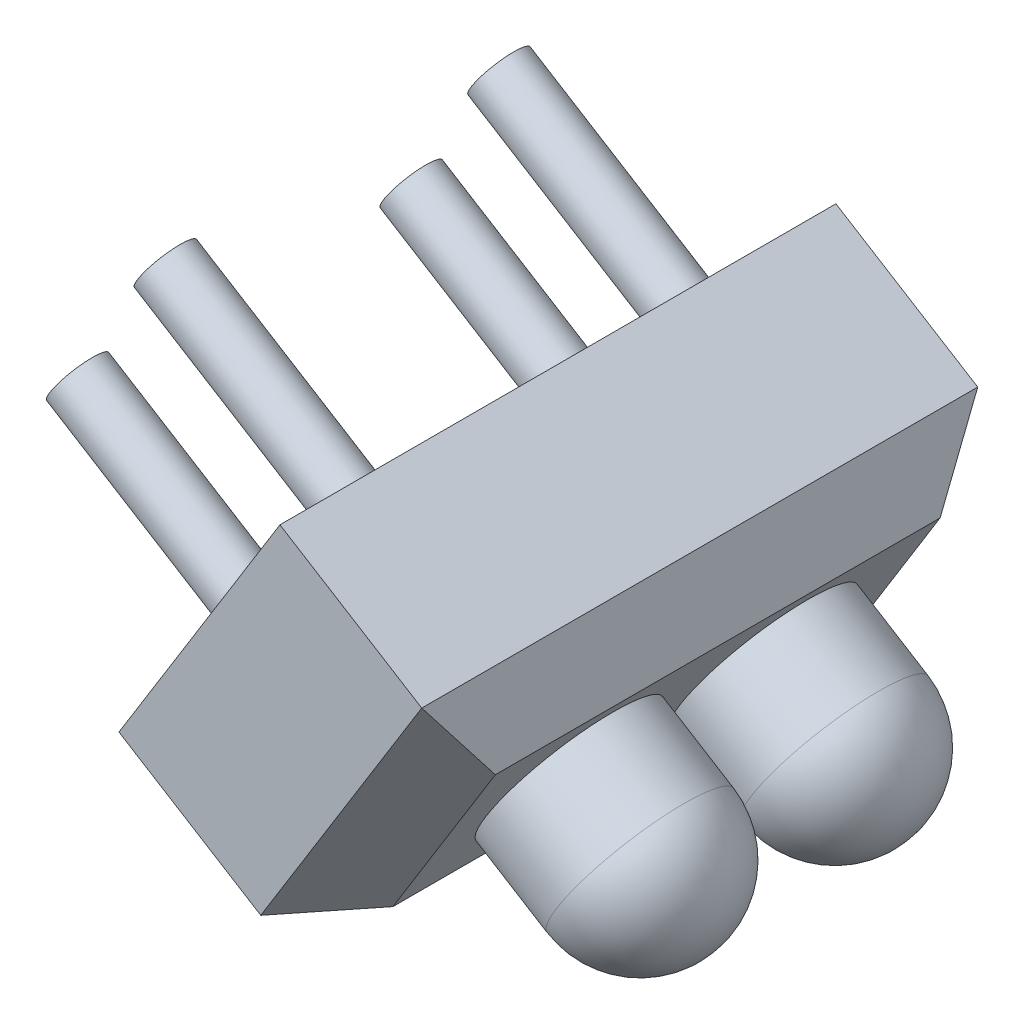
ISO-10303-21;
HEADER;
FILE_DESCRIPTION(('STEP AP214'),'2;1');
FILE_NAME('part.step','',(''),(''),'','','');
FILE_SCHEMA(('AUTOMOTIVE_DESIGN { 1 0 10303 214 1 1 1 1 }'));
ENDSEC;
DATA;
#1=APPLICATION_CONTEXT('core data for automotive mechanical design processes');
#2=APPLICATION_PROTOCOL_DEFINITION('international standard','automotive_design',2000,#1);
#3=PRODUCT_CONTEXT('',#1,'mechanical');
#4=PRODUCT('Part','Part','',(#3));
#5=PRODUCT_RELATED_PRODUCT_CATEGORY('part','',(#4));
#6=PRODUCT_DEFINITION_FORMATION('','',#4);
#7=PRODUCT_DEFINITION_CONTEXT('part definition',#1,'design');
#8=PRODUCT_DEFINITION('design','',#6,#7);
#9=PRODUCT_DEFINITION_SHAPE('','',#8);
#10=(LENGTH_UNIT() NAMED_UNIT(*) SI_UNIT(.MILLI.,.METRE.));
#11=(NAMED_UNIT(*) PLANE_ANGLE_UNIT() SI_UNIT($,.RADIAN.));
#12=(NAMED_UNIT(*) SI_UNIT($,.STERADIAN.) SOLID_ANGLE_UNIT());
#13=UNCERTAINTY_MEASURE_WITH_UNIT(LENGTH_MEASURE(1.E-05),#10,'distance_accuracy_value','');
#14=(GEOMETRIC_REPRESENTATION_CONTEXT(3) GLOBAL_UNCERTAINTY_ASSIGNED_CONTEXT((#13)) GLOBAL_UNIT_ASSIGNED_CONTEXT((#10,
#11,#12)) REPRESENTATION_CONTEXT('',''));
#15=CARTESIAN_POINT('',(0.,0.,0.));
#16=DIRECTION('',(0.,0.,1.));
#17=DIRECTION('',(1.,0.,0.));
#18=AXIS2_PLACEMENT_3D('',#15,#16,#17);
#19=CARTESIAN_POINT('',(-10.8716272687585,-17.7621904380699,9.99999999999932));
#20=DIRECTION('',(0.850181774681174,-0.526489268646541,0.));
#21=DIRECTION('',(0.526489268646541,0.850181774681174,0.));
#22=AXIS2_PLACEMENT_3D('',#19,#20,#21);
#23=CYLINDRICAL_SURFACE('',#22,0.500000000000001);
#24=CARTESIAN_POINT('',(-9.59635460673675,-18.5519243410397,9.99999999999931));
#25=DIRECTION('',(0.850181774681174,-0.526489268646541,0.));
#26=DIRECTION('',(0.526489268646541,0.850181774681174,0.));
#27=AXIS2_PLACEMENT_3D('',#24,#25,#26);
#28=CIRCLE('',#27,0.500000000000001);
#29=CARTESIAN_POINT('',(-9.33310997241347,-18.1268334536991,9.99999999999931));
#30=VERTEX_POINT('',#29);
#31=EDGE_CURVE('E13',#30,#30,#28,.F.);
#32=ORIENTED_EDGE('',*,*,#31,.F.);
#33=EDGE_LOOP('',(#32));
#34=FACE_BOUND('',#33,.T.);
#35=CARTESIAN_POINT('',(-6.19562750801203,-20.6578814156259,9.99999999999929));
#36=DIRECTION('',(0.850181774681174,-0.526489268646541,0.));
#37=DIRECTION('',(0.526489268646541,0.850181774681174,0.));
#38=AXIS2_PLACEMENT_3D('',#35,#36,#37);
#39=CIRCLE('',#38,0.500000000000001);
#40=CARTESIAN_POINT('',(-5.93238287368875,-20.2327905282853,9.99999999999929));
#41=VERTEX_POINT('',#40);
#42=EDGE_CURVE('E266',#41,#41,#39,.T.);
#43=ORIENTED_EDGE('',*,*,#42,.F.);
#44=EDGE_LOOP('',(#43));
#45=FACE_BOUND('',#44,.T.);
#46=ADVANCED_FACE('F259',(#34,#45),#23,.T.);
#47=CARTESIAN_POINT('',(-6.19562750801203,-20.6578814156259,9.99999999999929));
#48=DIRECTION('',(0.850181774681174,-0.526489268646541,0.));
#49=DIRECTION('',(0.526489268646541,0.850181774681174,0.));
#50=AXIS2_PLACEMENT_3D('',#47,#48,#49);
#51=PLANE('',#50);
#52=ORIENTED_EDGE('',*,*,#42,.T.);
#53=EDGE_LOOP('',(#52));
#54=FACE_BOUND('',#53,.T.);
#55=ADVANCED_FACE('F272',(#54),#51,.T.);
#56=CARTESIAN_POINT('',(11.4632161391248,15.4553466462074,-1.66728439301483));
#57=DIRECTION('',(0.850181774681174,-0.526489268646541,0.));
#58=DIRECTION('',(0.526489268646541,0.850181774681174,0.));
#59=AXIS2_PLACEMENT_3D('',#56,#57,#58);
#60=PLANE('',#59);
#61=ORIENTED_EDGE('',*,*,#31,.T.);
#62=EDGE_LOOP('',(#61));
#63=FACE_BOUND('',#62,.T.);
#64=ADVANCED_FACE('F261',(#63),#60,.F.);
#65=CLOSED_SHELL('',(#46,#55,#64));
#66=MANIFOLD_SOLID_BREP('B2',#65);
#67=CARTESIAN_POINT('',(-6.19562750801206,-20.6578814156259,3.99999999999996));
#68=DIRECTION('',(0.850181774681174,-0.526489268646541,0.));
#69=DIRECTION('',(0.526489268646541,0.850181774681174,0.));
#70=AXIS2_PLACEMENT_3D('',#67,#68,#69);
#71=PLANE('',#70);
#72=CARTESIAN_POINT('',(-6.19562750801206,-20.6578814156259,3.99999999999996));
#73=DIRECTION('',(0.850181774681174,-0.526489268646541,0.));
#74=DIRECTION('',(0.526489268646541,0.850181774681174,0.));
#75=AXIS2_PLACEMENT_3D('',#72,#73,#74);
#76=CIRCLE('',#75,0.500000000000001);
#77=CARTESIAN_POINT('',(-5.93238287368878,-20.2327905282853,3.99999999999996));
#78=VERTEX_POINT('',#77);
#79=EDGE_CURVE('E315',#78,#78,#76,.T.);
#80=ORIENTED_EDGE('',*,*,#79,.T.);
#81=EDGE_LOOP('',(#80));
#82=FACE_BOUND('',#81,.T.);
#83=ADVANCED_FACE('F308',(#82),#71,.T.);
#84=CARTESIAN_POINT('',(-10.8716272687585,-17.7621904380699,4.));
#85=DIRECTION('',(0.850181774681174,-0.526489268646541,0.));
#86=DIRECTION('',(0.526489268646541,0.850181774681174,0.));
#87=AXIS2_PLACEMENT_3D('',#84,#85,#86);
#88=CYLINDRICAL_SURFACE('',#87,0.500000000000001);
#89=CARTESIAN_POINT('',(-9.59635460673681,-18.5519243410397,3.99999999999999));
#90=DIRECTION('',(0.850181774681174,-0.526489268646541,0.));
#91=DIRECTION('',(0.526489268646541,0.850181774681174,0.));
#92=AXIS2_PLACEMENT_3D('',#89,#90,#91);
#93=CIRCLE('',#92,0.500000000000001);
#94=CARTESIAN_POINT('',(-9.33310997241354,-18.1268334536991,3.99999999999999));
#95=VERTEX_POINT('',#94);
#96=EDGE_CURVE('E258',#95,#95,#93,.F.);
#97=ORIENTED_EDGE('',*,*,#96,.F.);
#98=EDGE_LOOP('',(#97));
#99=FACE_BOUND('',#98,.T.);
#100=ORIENTED_EDGE('',*,*,#79,.F.);
#101=EDGE_LOOP('',(#100));
#102=FACE_BOUND('',#101,.T.);
#103=ADVANCED_FACE('F322',(#99,#102),#88,.T.);
#104=CARTESIAN_POINT('',(11.4632161391248,15.4553466462074,-1.66728439301483));
#105=DIRECTION('',(0.850181774681174,-0.526489268646541,0.));
#106=DIRECTION('',(0.526489268646541,0.850181774681174,0.));
#107=AXIS2_PLACEMENT_3D('',#104,#105,#106);
#108=PLANE('',#107);
#109=ORIENTED_EDGE('',*,*,#96,.T.);
#110=EDGE_LOOP('',(#109));
#111=FACE_BOUND('',#110,.T.);
#112=ADVANCED_FACE('F310',(#111),#108,.F.);
#113=CLOSED_SHELL('',(#83,#103,#112));
#114=MANIFOLD_SOLID_BREP('B8',#113);
#115=CARTESIAN_POINT('',(-7.77509531395168,-23.2084267396694,3.99999999999997));
#116=DIRECTION('',(0.850181774681174,-0.526489268646541,0.));
#117=DIRECTION('',(0.526489268646541,0.850181774681174,0.));
#118=AXIS2_PLACEMENT_3D('',#115,#116,#117);
#119=PLANE('',#118);
#120=CARTESIAN_POINT('',(-7.77509531395168,-23.2084267396694,3.99999999999997));
#121=DIRECTION('',(0.850181774681174,-0.526489268646541,0.));
#122=DIRECTION('',(0.526489268646541,0.850181774681174,0.));
#123=AXIS2_PLACEMENT_3D('',#120,#121,#122);
#124=CIRCLE('',#123,0.500000000000002);
#125=CARTESIAN_POINT('',(-7.51185067962841,-22.7833358523288,3.99999999999997));
#126=VERTEX_POINT('',#125);
#127=EDGE_CURVE('E367',#126,#126,#124,.T.);
#128=ORIENTED_EDGE('',*,*,#127,.T.);
#129=EDGE_LOOP('',(#128));
#130=FACE_BOUND('',#129,.T.);
#131=ADVANCED_FACE('F360',(#130),#119,.T.);
#132=CARTESIAN_POINT('',(-12.4510950746981,-20.3127357621134,4.));
#133=DIRECTION('',(0.850181774681174,-0.526489268646541,0.));
#134=DIRECTION('',(0.526489268646541,0.850181774681174,0.));
#135=AXIS2_PLACEMENT_3D('',#132,#133,#134);
#136=CYLINDRICAL_SURFACE('',#135,0.500000000000002);
#137=CARTESIAN_POINT('',(-11.1758224126764,-21.1024696650832,3.99999999999999));
#138=DIRECTION('',(0.850181774681174,-0.526489268646541,0.));
#139=DIRECTION('',(0.526489268646541,0.850181774681174,0.));
#140=AXIS2_PLACEMENT_3D('',#137,#138,#139);
#141=CIRCLE('',#140,0.500000000000002);
#142=CARTESIAN_POINT('',(-10.9125777783532,-20.6773787777426,3.99999999999999));
#143=VERTEX_POINT('',#142);
#144=EDGE_CURVE('E307',#143,#143,#141,.F.);
#145=ORIENTED_EDGE('',*,*,#144,.F.);
#146=EDGE_LOOP('',(#145));
#147=FACE_BOUND('',#146,.T.);
#148=ORIENTED_EDGE('',*,*,#127,.F.);
#149=EDGE_LOOP('',(#148));
#150=FACE_BOUND('',#149,.T.);
#151=ADVANCED_FACE('F374',(#147,#150),#136,.T.);
#152=CARTESIAN_POINT('',(11.4632161391248,15.4553466462074,-1.66728439301483));
#153=DIRECTION('',(0.850181774681174,-0.526489268646541,0.));
#154=DIRECTION('',(0.526489268646541,0.850181774681174,0.));
#155=AXIS2_PLACEMENT_3D('',#152,#153,#154);
#156=PLANE('',#155);
#157=ORIENTED_EDGE('',*,*,#144,.T.);
#158=EDGE_LOOP('',(#157));
#159=FACE_BOUND('',#158,.T.);
#160=ADVANCED_FACE('F362',(#159),#156,.F.);
#161=CLOSED_SHELL('',(#131,#151,#160));
#162=MANIFOLD_SOLID_BREP('B253',#161);
#163=CARTESIAN_POINT('',(-2.13678882347914,-21.7011112718606,11.9999999999993));
#164=DIRECTION('',(0.,0.,-1.));
#165=DIRECTION('',(-1.,0.,0.));
#166=AXIS2_PLACEMENT_3D('',#163,#164,#165);
#167=PLANE('',#166);
#168=DIRECTION('',(-0.850181774681174,0.526489268646541,0.));
#169=VECTOR('',#168,1.);
#170=CARTESIAN_POINT('',(-5.03247980103512,-26.3771110326071,11.9999999999993));
#171=LINE('',#170,#169);
#172=CARTESIAN_POINT('',(-5.88266157571629,-25.8506217639605,11.9999999999993));
#173=VERTEX_POINT('',#172);
#174=CARTESIAN_POINT('',(-8.43320689975981,-24.2711539580209,11.9999999999993));
#175=VERTEX_POINT('',#174);
#176=EDGE_CURVE('E461',#173,#175,#171,.T.);
#177=ORIENTED_EDGE('',*,*,#176,.F.);
#178=DIRECTION('',(0.526489268646542,0.850181774681174,0.));
#179=VECTOR('',#178,1.);
#180=CARTESIAN_POINT('',(-2.98697059816032,-21.1746220032141,11.9999999999993));
#181=LINE('',#180,#179);
#182=CARTESIAN_POINT('',(-2.98697059816032,-21.1746220032141,11.9999999999993));
#183=VERTEX_POINT('',#182);
#184=EDGE_CURVE('E424',#173,#183,#181,.T.);
#185=ORIENTED_EDGE('',*,*,#184,.T.);
#186=DIRECTION('',(-0.850181774681174,0.526489268646541,0.));
#187=VECTOR('',#186,1.);
#188=CARTESIAN_POINT('',(-2.13678882347914,-21.7011112718606,11.9999999999993));
#189=LINE('',#188,#187);
#190=CARTESIAN_POINT('',(-5.53751592220384,-19.5951541972744,11.9999999999993));
#191=VERTEX_POINT('',#190);
#192=EDGE_CURVE('E478',#183,#191,#189,.T.);
#193=ORIENTED_EDGE('',*,*,#192,.T.);
#194=DIRECTION('',(-0.526489268646542,-0.850181774681174,0.));
#195=VECTOR('',#194,1.);
#196=CARTESIAN_POINT('',(-5.53751592220384,-19.5951541972744,11.9999999999993));
#197=LINE('',#196,#195);
#198=EDGE_CURVE('E474',#191,#175,#197,.T.);
#199=ORIENTED_EDGE('',*,*,#198,.T.);
#200=EDGE_LOOP('',(#177,#185,#193,#199));
#201=FACE_BOUND('',#200,.T.);
#202=ADVANCED_FACE('F409',(#201),#167,.F.);
#203=CARTESIAN_POINT('',(-5.03247980103512,-26.3771110326071,11.9999999999993));
#204=DIRECTION('',(0.526489268646541,0.850181774681174,0.));
#205=DIRECTION('',(-0.850181774681174,0.526489268646541,0.));
#206=AXIS2_PLACEMENT_3D('',#203,#204,#205);
#207=PLANE('',#206);
#208=DIRECTION('',(-0.850181774681174,0.526489268646541,0.));
#209=VECTOR('',#208,1.);
#210=CARTESIAN_POINT('',(-5.03247980103517,-26.377111032607,1.99999999999926));
#211=LINE('',#210,#209);
#212=CARTESIAN_POINT('',(-5.88266157571634,-25.8506217639605,1.99999999999927));
#213=VERTEX_POINT('',#212);
#214=CARTESIAN_POINT('',(-8.43320689975987,-24.2711539580209,1.99999999999928));
#215=VERTEX_POINT('',#214);
#216=EDGE_CURVE('E468',#213,#215,#211,.T.);
#217=ORIENTED_EDGE('',*,*,#216,.F.);
#218=DIRECTION('',(0.,0.,1.));
#219=VECTOR('',#218,1.);
#220=CARTESIAN_POINT('',(-5.88266157571629,-25.8506217639605,11.9999999999993));
#221=LINE('',#220,#219);
#222=EDGE_CURVE('E432',#213,#173,#221,.T.);
#223=ORIENTED_EDGE('',*,*,#222,.T.);
#224=ORIENTED_EDGE('',*,*,#176,.T.);
#225=DIRECTION('',(0.,0.,-1.));
#226=VECTOR('',#225,1.);
#227=CARTESIAN_POINT('',(-8.43320689975981,-24.2711539580209,11.9999999999993));
#228=LINE('',#227,#226);
#229=EDGE_CURVE('E464',#175,#215,#228,.T.);
#230=ORIENTED_EDGE('',*,*,#229,.T.);
#231=EDGE_LOOP('',(#217,#223,#224,#230));
#232=FACE_BOUND('',#231,.T.);
#233=ADVANCED_FACE('F463',(#232),#207,.F.);
#234=CARTESIAN_POINT('',(-2.13678882347919,-21.7011112718606,1.99999999999926));
#235=DIRECTION('',(0.,0.,1.));
#236=DIRECTION('',(1.,0.,0.));
#237=AXIS2_PLACEMENT_3D('',#234,#235,#236);
#238=PLANE('',#237);
#239=DIRECTION('',(-0.850181774681174,0.526489268646541,0.));
#240=VECTOR('',#239,1.);
#241=CARTESIAN_POINT('',(-2.13678882347919,-21.7011112718606,1.99999999999926));
#242=LINE('',#241,#240);
#243=CARTESIAN_POINT('',(-2.98697059816037,-21.174622003214,1.99999999999927));
#244=VERTEX_POINT('',#243);
#245=CARTESIAN_POINT('',(-5.53751592220389,-19.5951541972744,1.99999999999929));
#246=VERTEX_POINT('',#245);
#247=EDGE_CURVE('E493',#244,#246,#242,.T.);
#248=ORIENTED_EDGE('',*,*,#247,.F.);
#249=DIRECTION('',(-0.526489268646542,-0.850181774681174,0.));
#250=VECTOR('',#249,1.);
#251=CARTESIAN_POINT('',(-5.88266157571635,-25.8506217639605,1.99999999999927));
#252=LINE('',#251,#250);
#253=EDGE_CURVE('E504',#244,#213,#252,.T.);
#254=ORIENTED_EDGE('',*,*,#253,.T.);
#255=ORIENTED_EDGE('',*,*,#216,.T.);
#256=DIRECTION('',(0.526489268646541,0.850181774681174,0.));
#257=VECTOR('',#256,1.);
#258=CARTESIAN_POINT('',(-5.53751592220389,-19.5951541972744,1.99999999999929));
#259=LINE('',#258,#257);
#260=EDGE_CURVE('E476',#215,#246,#259,.T.);
#261=ORIENTED_EDGE('',*,*,#260,.T.);
#262=EDGE_LOOP('',(#248,#254,#255,#261));
#263=FACE_BOUND('',#262,.T.);
#264=ADVANCED_FACE('F538',(#263),#238,.F.);
#265=CARTESIAN_POINT('',(-2.13678882347914,-21.7011112718606,11.9999999999993));
#266=DIRECTION('',(-0.526489268646541,-0.850181774681174,0.));
#267=DIRECTION('',(0.850181774681174,-0.526489268646541,0.));
#268=AXIS2_PLACEMENT_3D('',#265,#266,#267);
#269=PLANE('',#268);
#270=ORIENTED_EDGE('',*,*,#192,.F.);
#271=DIRECTION('',(0.,0.,-1.));
#272=VECTOR('',#271,1.);
#273=CARTESIAN_POINT('',(-2.98697059816037,-21.174622003214,1.99999999999927));
#274=LINE('',#273,#272);
#275=EDGE_CURVE('E509',#183,#244,#274,.T.);
#276=ORIENTED_EDGE('',*,*,#275,.T.);
#277=ORIENTED_EDGE('',*,*,#247,.T.);
#278=DIRECTION('',(0.,0.,1.));
#279=VECTOR('',#278,1.);
#280=CARTESIAN_POINT('',(-5.53751592220384,-19.5951541972744,11.9999999999993));
#281=LINE('',#280,#279);
#282=EDGE_CURVE('E490',#246,#191,#281,.T.);
#283=ORIENTED_EDGE('',*,*,#282,.T.);
#284=EDGE_LOOP('',(#270,#276,#277,#283));
#285=FACE_BOUND('',#284,.T.);
#286=ADVANCED_FACE('F569',(#285),#269,.F.);
#287=CARTESIAN_POINT('',(8.16917842128115,-5.05890022645608,0.));
#288=DIRECTION('',(0.850181774681174,-0.526489268646542,0.));
#289=DIRECTION('',(0.526489268646542,0.850181774681174,0.));
#290=AXIS2_PLACEMENT_3D('',#287,#288,#289);
#291=PLANE('',#290);
#292=CARTESIAN_POINT('',(-3.58463431225716,-24.0391111522338,5.24999999999926));
#293=DIRECTION('',(0.850181774681174,-0.526489268646542,0.));
#294=DIRECTION('',(0.526489268646542,0.850181774681174,0.));
#295=AXIS2_PLACEMENT_3D('',#292,#293,#294);
#296=CIRCLE('',#295,1.5);
#297=CARTESIAN_POINT('',(-2.79490040928735,-22.763838490212,5.24999999999926));
#298=VERTEX_POINT('',#297);
#299=EDGE_CURVE('E678',#298,#298,#296,.T.);
#300=ORIENTED_EDGE('',*,*,#299,.F.);
#301=EDGE_LOOP('',(#300));
#302=FACE_BOUND('',#301,.T.);
#303=CARTESIAN_POINT('',(-3.58463431225715,-24.0391111522338,8.74999999999926));
#304=DIRECTION('',(0.850181774681174,-0.526489268646542,0.));
#305=DIRECTION('',(0.526489268646542,0.850181774681174,0.));
#306=AXIS2_PLACEMENT_3D('',#303,#304,#305);
#307=CIRCLE('',#306,1.5);
#308=CARTESIAN_POINT('',(-2.79490040928733,-22.7638384902121,8.74999999999926));
#309=VERTEX_POINT('',#308);
#310=EDGE_CURVE('E486',#309,#309,#307,.T.);
#311=ORIENTED_EDGE('',*,*,#310,.F.);
#312=EDGE_LOOP('',(#311));
#313=FACE_BOUND('',#312,.T.);
#314=DIRECTION('',(0.,0.,-1.));
#315=VECTOR('',#314,1.);
#316=CARTESIAN_POINT('',(-4.50599053238863,-25.5269292579258,1.99999999999926));
#317=LINE('',#316,#315);
#318=CARTESIAN_POINT('',(-4.50599053238858,-25.5269292579259,10.9999999999993));
#319=VERTEX_POINT('',#318);
#320=CARTESIAN_POINT('',(-4.50599053238862,-25.5269292579258,2.99999999999926));
#321=VERTEX_POINT('',#320);
#322=EDGE_CURVE('E499',#319,#321,#317,.T.);
#323=ORIENTED_EDGE('',*,*,#322,.T.);
#324=DIRECTION('',(0.526489268646542,0.850181774681174,0.));
#325=VECTOR('',#324,1.);
#326=CARTESIAN_POINT('',(-2.13678882347919,-21.7011112718606,2.99999999999926));
#327=LINE('',#326,#325);
#328=CARTESIAN_POINT('',(-2.66327809212573,-22.5512930465418,2.99999999999926));
#329=VERTEX_POINT('',#328);
#330=EDGE_CURVE('E501',#321,#329,#327,.T.);
#331=ORIENTED_EDGE('',*,*,#330,.T.);
#332=DIRECTION('',(0.,0.,1.));
#333=VECTOR('',#332,1.);
#334=CARTESIAN_POINT('',(-2.66327809212568,-22.5512930465418,11.9999999999993));
#335=LINE('',#334,#333);
#336=CARTESIAN_POINT('',(-2.66327809212569,-22.5512930465418,10.9999999999993));
#337=VERTEX_POINT('',#336);
#338=EDGE_CURVE('E467',#329,#337,#335,.T.);
#339=ORIENTED_EDGE('',*,*,#338,.T.);
#340=DIRECTION('',(-0.526489268646542,-0.850181774681174,0.));
#341=VECTOR('',#340,1.);
#342=CARTESIAN_POINT('',(-5.03247980103512,-26.3771110326071,10.9999999999993));
#343=LINE('',#342,#341);
#344=EDGE_CURVE('E497',#337,#319,#343,.T.);
#345=ORIENTED_EDGE('',*,*,#344,.T.);
#346=EDGE_LOOP('',(#323,#331,#339,#345));
#347=FACE_BOUND('',#346,.T.);
#348=ADVANCED_FACE('F559',(#302,#313,#347),#291,.T.);
#349=CARTESIAN_POINT('',(4.76845132255646,-2.95294315186992,0.));
#350=DIRECTION('',(0.850181774681174,-0.526489268646542,0.));
#351=DIRECTION('',(0.526489268646542,0.850181774681174,0.));
#352=AXIS2_PLACEMENT_3D('',#349,#350,#351);
#353=PLANE('',#352);
#354=ORIENTED_EDGE('',*,*,#198,.F.);
#355=ORIENTED_EDGE('',*,*,#282,.F.);
#356=ORIENTED_EDGE('',*,*,#260,.F.);
#357=ORIENTED_EDGE('',*,*,#229,.F.);
#358=EDGE_LOOP('',(#354,#355,#356,#357));
#359=FACE_BOUND('',#358,.T.);
#360=ADVANCED_FACE('F472',(#359),#353,.F.);
#361=CARTESIAN_POINT('',(8.16917842128121,-5.05890022645611,10.9999999999993));
#362=DIRECTION('',(0.601169298118274,-0.372284132081917,0.707106781186544));
#363=DIRECTION('',(0.526489268646542,0.850181774681174,0.));
#364=AXIS2_PLACEMENT_3D('',#361,#362,#363);
#365=PLANE('',#364);
#366=DIRECTION('',(0.186883955493757,-0.794821397450818,-0.577350269189628));
#367=VECTOR('',#366,1.);
#368=CARTESIAN_POINT('',(-1.4764055699988,-27.5990868720764,7.33333333333281));
#369=LINE('',#368,#367);
#370=EDGE_CURVE('E483',#183,#337,#369,.T.);
#371=ORIENTED_EDGE('',*,*,#370,.F.);
#372=ORIENTED_EDGE('',*,*,#184,.F.);
#373=DIRECTION('',(0.794821397450818,0.186883955493765,-0.577350269189626));
#374=VECTOR('',#373,1.);
#375=CARTESIAN_POINT('',(6.54174212932466,-22.9293092319924,2.97503810713597));
#376=LINE('',#375,#374);
#377=EDGE_CURVE('E480',#319,#173,#376,.F.);
#378=ORIENTED_EDGE('',*,*,#377,.F.);
#379=ORIENTED_EDGE('',*,*,#344,.F.);
#380=EDGE_LOOP('',(#371,#372,#378,#379));
#381=FACE_BOUND('',#380,.T.);
#382=ADVANCED_FACE('F552',(#381),#365,.T.);
#383=CARTESIAN_POINT('',(-4.50599053238864,-25.5269292579258,0.));
#384=DIRECTION('',(0.22888516603636,-0.973453430200186,0.));
#385=DIRECTION('',(0.,0.,1.));
#386=AXIS2_PLACEMENT_3D('',#383,#384,#385);
#387=PLANE('',#386);
#388=ORIENTED_EDGE('',*,*,#377,.T.);
#389=ORIENTED_EDGE('',*,*,#222,.F.);
#390=DIRECTION('',(0.794821397450822,0.186883955493761,0.577350269189621));
#391=VECTOR('',#390,1.);
#392=CARTESIAN_POINT('',(-5.88266157571603,-25.8506217639604,1.9999999999995));
#393=LINE('',#392,#391);
#394=EDGE_CURVE('E513',#321,#213,#393,.F.);
#395=ORIENTED_EDGE('',*,*,#394,.F.);
#396=ORIENTED_EDGE('',*,*,#322,.F.);
#397=EDGE_LOOP('',(#388,#389,#395,#396));
#398=FACE_BOUND('',#397,.T.);
#399=ADVANCED_FACE('F549',(#398),#387,.T.);
#400=CARTESIAN_POINT('',(-2.66327809212575,-22.5512930465417,0.));
#401=DIRECTION('',(0.973453430200187,0.228885166036357,0.));
#402=DIRECTION('',(0.,0.,-1.));
#403=AXIS2_PLACEMENT_3D('',#400,#401,#402);
#404=PLANE('',#403);
#405=ORIENTED_EDGE('',*,*,#370,.T.);
#406=ORIENTED_EDGE('',*,*,#338,.F.);
#407=DIRECTION('',(-0.186883955493763,0.794821397450821,-0.577350269189623));
#408=VECTOR('',#407,1.);
#409=CARTESIAN_POINT('',(-2.9869705981603,-21.1746220032143,1.99999999999949));
#410=LINE('',#409,#408);
#411=EDGE_CURVE('E511',#244,#329,#410,.F.);
#412=ORIENTED_EDGE('',*,*,#411,.F.);
#413=ORIENTED_EDGE('',*,*,#275,.F.);
#414=EDGE_LOOP('',(#405,#406,#412,#413));
#415=FACE_BOUND('',#414,.T.);
#416=ADVANCED_FACE('F545',(#415),#404,.T.);
#417=CARTESIAN_POINT('',(8.16917842128117,-5.05890022645609,2.99999999999927));
#418=DIRECTION('',(0.601169298118268,-0.372284132081913,-0.707106781186552));
#419=DIRECTION('',(-0.526489268646542,-0.850181774681174,0.));
#420=AXIS2_PLACEMENT_3D('',#417,#418,#419);
#421=PLANE('',#420);
#422=ORIENTED_EDGE('',*,*,#394,.T.);
#423=ORIENTED_EDGE('',*,*,#253,.F.);
#424=ORIENTED_EDGE('',*,*,#411,.T.);
#425=ORIENTED_EDGE('',*,*,#330,.F.);
#426=EDGE_LOOP('',(#422,#423,#424,#425));
#427=FACE_BOUND('',#426,.T.);
#428=ADVANCED_FACE('F542',(#427),#421,.T.);
#429=CARTESIAN_POINT('',(-1.03408898821362,-25.6185789581734,8.74999999999924));
#430=DIRECTION('',(-0.850181774681173,0.526489268646542,0.));
#431=DIRECTION('',(-0.526489268646542,-0.850181774681174,0.));
#432=AXIS2_PLACEMENT_3D('',#429,#430,#431);
#433=CYLINDRICAL_SURFACE('',#432,1.5);
#434=CARTESIAN_POINT('',(-2.30936165023539,-24.8288450552036,8.74999999999925));
#435=DIRECTION('',(-0.850181774681173,0.526489268646542,0.));
#436=DIRECTION('',(-0.526489268646542,-0.850181774681174,0.));
#437=AXIS2_PLACEMENT_3D('',#434,#435,#436);
#438=CIRCLE('',#437,1.5);
#439=CARTESIAN_POINT('',(-3.0990955532052,-26.1041177172254,8.74999999999925));
#440=VERTEX_POINT('',#439);
#441=EDGE_CURVE('E417',#440,#440,#438,.T.);
#442=ORIENTED_EDGE('',*,*,#441,.T.);
#443=EDGE_LOOP('',(#442));
#444=FACE_BOUND('',#443,.T.);
#445=ORIENTED_EDGE('',*,*,#310,.T.);
#446=EDGE_LOOP('',(#445));
#447=FACE_BOUND('',#446,.T.);
#448=ADVANCED_FACE('F519',(#444,#447),#433,.T.);
#449=CARTESIAN_POINT('',(-1.03408898821364,-25.6185789581734,5.24999999999924));
#450=DIRECTION('',(-0.850181774681173,0.526489268646542,0.));
#451=DIRECTION('',(-0.526489268646542,-0.850181774681174,0.));
#452=AXIS2_PLACEMENT_3D('',#449,#450,#451);
#453=CYLINDRICAL_SURFACE('',#452,1.5);
#454=CARTESIAN_POINT('',(-2.3093616502354,-24.8288450552036,5.24999999999925));
#455=DIRECTION('',(-0.850181774681173,0.526489268646542,0.));
#456=DIRECTION('',(-0.526489268646542,-0.850181774681174,0.));
#457=AXIS2_PLACEMENT_3D('',#454,#455,#456);
#458=CIRCLE('',#457,1.5);
#459=CARTESIAN_POINT('',(-3.09909555320522,-26.1041177172254,5.24999999999925));
#460=VERTEX_POINT('',#459);
#461=EDGE_CURVE('E358',#460,#460,#458,.T.);
#462=ORIENTED_EDGE('',*,*,#461,.T.);
#463=EDGE_LOOP('',(#462));
#464=FACE_BOUND('',#463,.T.);
#465=ORIENTED_EDGE('',*,*,#299,.T.);
#466=EDGE_LOOP('',(#465));
#467=FACE_BOUND('',#466,.T.);
#468=ADVANCED_FACE('F524',(#464,#467),#453,.T.);
#469=CARTESIAN_POINT('',(-2.30936165023539,-24.8288450552036,8.74999999999925));
#470=DIRECTION('',(0.850181774681174,-0.526489268646542,0.));
#471=DIRECTION('',(0.526489268646542,0.850181774681174,0.));
#472=AXIS2_PLACEMENT_3D('',#469,#470,#471);
#473=SPHERICAL_SURFACE('',#472,1.5);
#474=ORIENTED_EDGE('',*,*,#441,.F.);
#475=EDGE_LOOP('',(#474));
#476=FACE_BOUND('',#475,.T.);
#477=ADVANCED_FACE('F522',(#476),#473,.T.);
#478=CARTESIAN_POINT('',(-2.3093616502354,-24.8288450552036,5.24999999999925));
#479=DIRECTION('',(0.850181774681174,-0.526489268646542,0.));
#480=DIRECTION('',(0.526489268646542,0.850181774681174,0.));
#481=AXIS2_PLACEMENT_3D('',#478,#479,#480);
#482=SPHERICAL_SURFACE('',#481,1.5);
#483=ORIENTED_EDGE('',*,*,#461,.F.);
#484=EDGE_LOOP('',(#483));
#485=FACE_BOUND('',#484,.T.);
#486=ADVANCED_FACE('F411',(#485),#482,.T.);
#487=CLOSED_SHELL('',(#202,#233,#264,#286,#348,#360,#382,#399,#416,#428,#448,#468,#477,#486));
#488=MANIFOLD_SOLID_BREP('B302',#487);
#489=CARTESIAN_POINT('',(-7.77509531395165,-23.2084267396694,9.99999999999929));
#490=DIRECTION('',(0.850181774681174,-0.526489268646541,0.));
#491=DIRECTION('',(0.526489268646541,0.850181774681174,0.));
#492=AXIS2_PLACEMENT_3D('',#489,#490,#491);
#493=PLANE('',#492);
#494=CARTESIAN_POINT('',(-7.77509531395165,-23.2084267396694,9.99999999999929));
#495=DIRECTION('',(0.850181774681174,-0.526489268646541,0.));
#496=DIRECTION('',(0.526489268646541,0.850181774681174,0.));
#497=AXIS2_PLACEMENT_3D('',#494,#495,#496);
#498=CIRCLE('',#497,0.500000000000004);
#499=CARTESIAN_POINT('',(-7.51185067962838,-22.7833358523288,9.99999999999929));
#500=VERTEX_POINT('',#499);
#501=EDGE_CURVE('E408',#500,#500,#498,.T.);
#502=ORIENTED_EDGE('',*,*,#501,.T.);
#503=EDGE_LOOP('',(#502));
#504=FACE_BOUND('',#503,.T.);
#505=ADVANCED_FACE('F686',(#504),#493,.T.);
#506=CARTESIAN_POINT('',(-12.4510950746981,-20.3127357621134,9.99999999999932));
#507=DIRECTION('',(0.850181774681174,-0.526489268646541,0.));
#508=DIRECTION('',(0.526489268646541,0.850181774681174,0.));
#509=AXIS2_PLACEMENT_3D('',#506,#507,#508);
#510=CYLINDRICAL_SURFACE('',#509,0.500000000000004);
#511=CARTESIAN_POINT('',(-11.1758224126764,-21.1024696650832,9.99999999999931));
#512=DIRECTION('',(0.850181774681174,-0.526489268646541,0.));
#513=DIRECTION('',(0.526489268646541,0.850181774681174,0.));
#514=AXIS2_PLACEMENT_3D('',#511,#512,#513);
#515=CIRCLE('',#514,0.500000000000004);
#516=CARTESIAN_POINT('',(-10.9125777783531,-20.6773787777427,9.99999999999931));
#517=VERTEX_POINT('',#516);
#518=EDGE_CURVE('E693',#517,#517,#515,.F.);
#519=ORIENTED_EDGE('',*,*,#518,.F.);
#520=EDGE_LOOP('',(#519));
#521=FACE_BOUND('',#520,.T.);
#522=ORIENTED_EDGE('',*,*,#501,.F.);
#523=EDGE_LOOP('',(#522));
#524=FACE_BOUND('',#523,.T.);
#525=ADVANCED_FACE('F688',(#521,#524),#510,.T.);
#526=CARTESIAN_POINT('',(11.4632161391248,15.4553466462074,-1.66728439301483));
#527=DIRECTION('',(0.850181774681174,-0.526489268646541,0.));
#528=DIRECTION('',(0.526489268646541,0.850181774681174,0.));
#529=AXIS2_PLACEMENT_3D('',#526,#527,#528);
#530=PLANE('',#529);
#531=ORIENTED_EDGE('',*,*,#518,.T.);
#532=EDGE_LOOP('',(#531));
#533=FACE_BOUND('',#532,.T.);
#534=ADVANCED_FACE('F699',(#533),#530,.F.);
#535=CLOSED_SHELL('',(#505,#525,#534));
#536=MANIFOLD_SOLID_BREP('B352',#535);
#537=ADVANCED_BREP_SHAPE_REPRESENTATION('',(#18,#66,#114,#162,#488,#536),#14);
#538=SHAPE_DEFINITION_REPRESENTATION(#9,#537);
ENDSEC;
END-ISO-10303-21;
